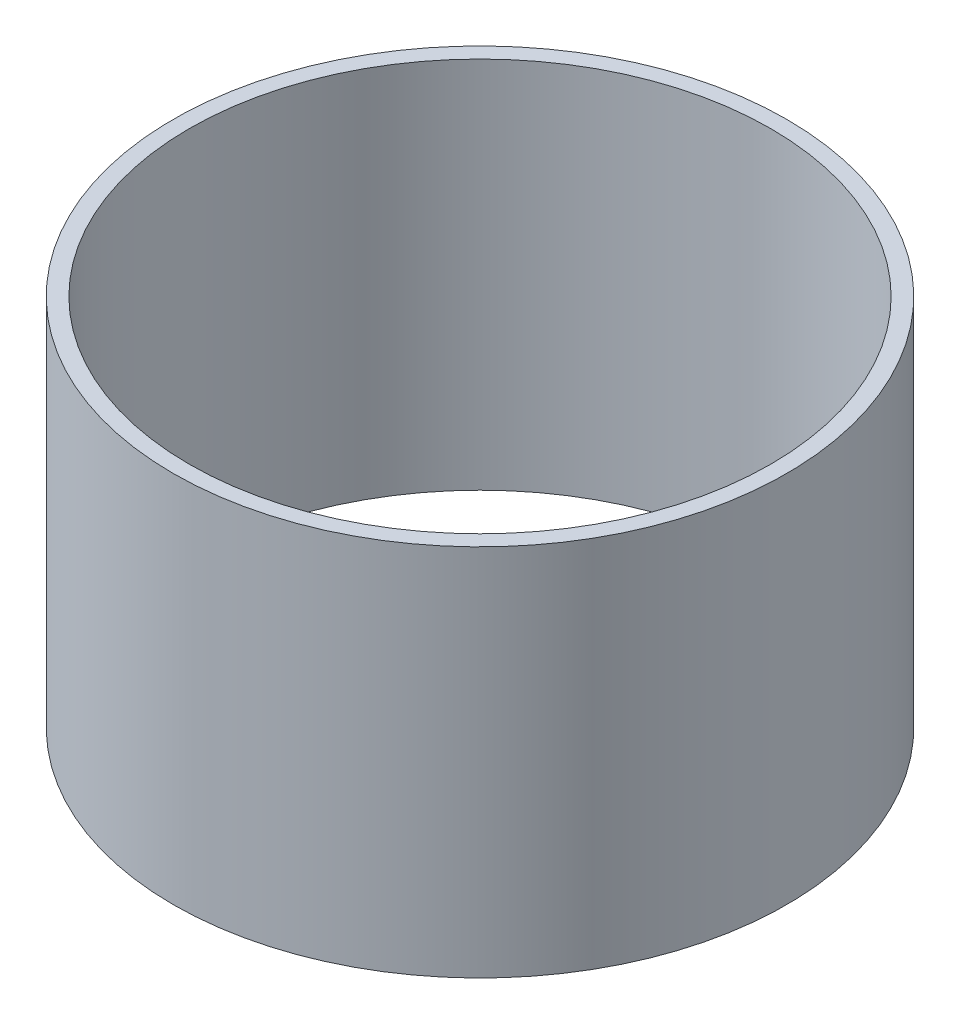
ISO-10303-21;
HEADER;
FILE_DESCRIPTION(('STEP AP214'),'2;1');
FILE_NAME('part.step','',(''),(''),'','','');
FILE_SCHEMA(('AUTOMOTIVE_DESIGN { 1 0 10303 214 1 1 1 1 }'));
ENDSEC;
DATA;
#1=APPLICATION_CONTEXT('core data for automotive mechanical design processes');
#2=APPLICATION_PROTOCOL_DEFINITION('international standard','automotive_design',2000,#1);
#3=PRODUCT_CONTEXT('',#1,'mechanical');
#4=PRODUCT('Part','Part','',(#3));
#5=PRODUCT_RELATED_PRODUCT_CATEGORY('part','',(#4));
#6=PRODUCT_DEFINITION_FORMATION('','',#4);
#7=PRODUCT_DEFINITION_CONTEXT('part definition',#1,'design');
#8=PRODUCT_DEFINITION('design','',#6,#7);
#9=PRODUCT_DEFINITION_SHAPE('','',#8);
#10=(LENGTH_UNIT() NAMED_UNIT(*) SI_UNIT(.MILLI.,.METRE.));
#11=(NAMED_UNIT(*) PLANE_ANGLE_UNIT() SI_UNIT($,.RADIAN.));
#12=(NAMED_UNIT(*) SI_UNIT($,.STERADIAN.) SOLID_ANGLE_UNIT());
#13=UNCERTAINTY_MEASURE_WITH_UNIT(LENGTH_MEASURE(1.E-05),#10,'distance_accuracy_value','');
#14=(GEOMETRIC_REPRESENTATION_CONTEXT(3) GLOBAL_UNCERTAINTY_ASSIGNED_CONTEXT((#13)) GLOBAL_UNIT_ASSIGNED_CONTEXT((#10,
#11,#12)) REPRESENTATION_CONTEXT('',''));
#15=CARTESIAN_POINT('',(0.,0.,0.));
#16=DIRECTION('',(0.,0.,1.));
#17=DIRECTION('',(1.,0.,0.));
#18=AXIS2_PLACEMENT_3D('',#15,#16,#17);
#19=CARTESIAN_POINT('',(0.,70.,0.));
#20=DIRECTION('',(0.,1.,0.));
#21=DIRECTION('',(0.,0.,1.));
#22=AXIS2_PLACEMENT_3D('',#19,#20,#21);
#23=PLANE('',#22);
#24=CARTESIAN_POINT('',(0.,70.,0.));
#25=DIRECTION('',(0.,1.,0.));
#26=DIRECTION('',(0.,0.,1.));
#27=AXIS2_PLACEMENT_3D('',#24,#25,#26);
#28=CIRCLE('',#27,57.5);
#29=CARTESIAN_POINT('',(0.,70.,57.5));
#30=VERTEX_POINT('',#29);
#31=EDGE_CURVE('E10',#30,#30,#28,.T.);
#32=ORIENTED_EDGE('',*,*,#31,.T.);
#33=EDGE_LOOP('',(#32));
#34=FACE_BOUND('',#33,.T.);
#35=CARTESIAN_POINT('',(0.,70.,0.));
#36=DIRECTION('',(0.,1.,0.));
#37=DIRECTION('',(0.,0.,1.));
#38=AXIS2_PLACEMENT_3D('',#35,#36,#37);
#39=CIRCLE('',#38,54.5);
#40=CARTESIAN_POINT('',(0.,70.,54.5));
#41=VERTEX_POINT('',#40);
#42=EDGE_CURVE('E42',#41,#41,#39,.T.);
#43=ORIENTED_EDGE('',*,*,#42,.F.);
#44=EDGE_LOOP('',(#43));
#45=FACE_BOUND('',#44,.T.);
#46=ADVANCED_FACE('F31',(#34,#45),#23,.T.);
#47=CARTESIAN_POINT('',(0.,0.,0.));
#48=DIRECTION('',(0.,1.,0.));
#49=DIRECTION('',(0.,0.,1.));
#50=AXIS2_PLACEMENT_3D('',#47,#48,#49);
#51=PLANE('',#50);
#52=CARTESIAN_POINT('',(0.,0.,0.));
#53=DIRECTION('',(0.,1.,0.));
#54=DIRECTION('',(0.,0.,1.));
#55=AXIS2_PLACEMENT_3D('',#52,#53,#54);
#56=CIRCLE('',#55,57.5);
#57=CARTESIAN_POINT('',(0.,0.,57.5));
#58=VERTEX_POINT('',#57);
#59=EDGE_CURVE('E35',#58,#58,#56,.T.);
#60=ORIENTED_EDGE('',*,*,#59,.F.);
#61=EDGE_LOOP('',(#60));
#62=FACE_BOUND('',#61,.T.);
#63=CARTESIAN_POINT('',(0.,0.,0.));
#64=DIRECTION('',(0.,1.,0.));
#65=DIRECTION('',(0.,0.,1.));
#66=AXIS2_PLACEMENT_3D('',#63,#64,#65);
#67=CIRCLE('',#66,54.5);
#68=CARTESIAN_POINT('',(0.,0.,54.5));
#69=VERTEX_POINT('',#68);
#70=EDGE_CURVE('E44',#69,#69,#67,.T.);
#71=ORIENTED_EDGE('',*,*,#70,.T.);
#72=EDGE_LOOP('',(#71));
#73=FACE_BOUND('',#72,.T.);
#74=ADVANCED_FACE('F54',(#62,#73),#51,.F.);
#75=CARTESIAN_POINT('',(0.,70.,0.));
#76=DIRECTION('',(0.,-1.,0.));
#77=DIRECTION('',(0.,0.,-1.));
#78=AXIS2_PLACEMENT_3D('',#75,#76,#77);
#79=CYLINDRICAL_SURFACE('',#78,57.5);
#80=ORIENTED_EDGE('',*,*,#31,.F.);
#81=EDGE_LOOP('',(#80));
#82=FACE_BOUND('',#81,.T.);
#83=ORIENTED_EDGE('',*,*,#59,.T.);
#84=EDGE_LOOP('',(#83));
#85=FACE_BOUND('',#84,.T.);
#86=ADVANCED_FACE('F33',(#82,#85),#79,.T.);
#87=CARTESIAN_POINT('',(0.,70.,0.));
#88=DIRECTION('',(0.,-1.,0.));
#89=DIRECTION('',(0.,0.,-1.));
#90=AXIS2_PLACEMENT_3D('',#87,#88,#89);
#91=CYLINDRICAL_SURFACE('',#90,54.5);
#92=ORIENTED_EDGE('',*,*,#42,.T.);
#93=EDGE_LOOP('',(#92));
#94=FACE_BOUND('',#93,.T.);
#95=ORIENTED_EDGE('',*,*,#70,.F.);
#96=EDGE_LOOP('',(#95));
#97=FACE_BOUND('',#96,.T.);
#98=ADVANCED_FACE('F50',(#94,#97),#91,.F.);
#99=CLOSED_SHELL('',(#46,#74,#86,#98));
#100=MANIFOLD_SOLID_BREP('B2',#99);
#101=ADVANCED_BREP_SHAPE_REPRESENTATION('',(#18,#100),#14);
#102=SHAPE_DEFINITION_REPRESENTATION(#9,#101);
ENDSEC;
END-ISO-10303-21;
